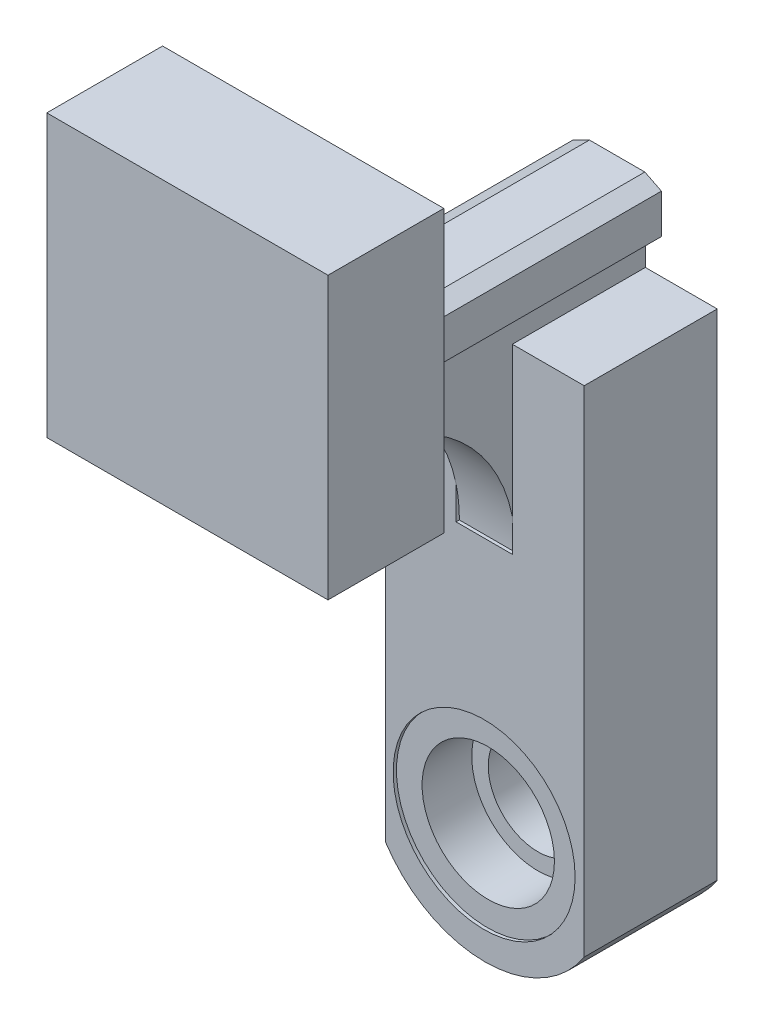
ISO-10303-21;
HEADER;
FILE_DESCRIPTION(('STEP AP214'),'2;1');
FILE_NAME('part.step','',(''),(''),'','','');
FILE_SCHEMA(('AUTOMOTIVE_DESIGN { 1 0 10303 214 1 1 1 1 }'));
ENDSEC;
DATA;
#1=APPLICATION_CONTEXT('core data for automotive mechanical design processes');
#2=APPLICATION_PROTOCOL_DEFINITION('international standard','automotive_design',2000,#1);
#3=PRODUCT_CONTEXT('',#1,'mechanical');
#4=PRODUCT('Part','Part','',(#3));
#5=PRODUCT_RELATED_PRODUCT_CATEGORY('part','',(#4));
#6=PRODUCT_DEFINITION_FORMATION('','',#4);
#7=PRODUCT_DEFINITION_CONTEXT('part definition',#1,'design');
#8=PRODUCT_DEFINITION('design','',#6,#7);
#9=PRODUCT_DEFINITION_SHAPE('','',#8);
#10=(LENGTH_UNIT() NAMED_UNIT(*) SI_UNIT(.MILLI.,.METRE.));
#11=(NAMED_UNIT(*) PLANE_ANGLE_UNIT() SI_UNIT($,.RADIAN.));
#12=(NAMED_UNIT(*) SI_UNIT($,.STERADIAN.) SOLID_ANGLE_UNIT());
#13=UNCERTAINTY_MEASURE_WITH_UNIT(LENGTH_MEASURE(1.E-05),#10,'distance_accuracy_value','');
#14=(GEOMETRIC_REPRESENTATION_CONTEXT(3) GLOBAL_UNCERTAINTY_ASSIGNED_CONTEXT((#13)) GLOBAL_UNIT_ASSIGNED_CONTEXT((#10,
#11,#12)) REPRESENTATION_CONTEXT('',''));
#15=CARTESIAN_POINT('',(0.,0.,0.));
#16=DIRECTION('',(0.,0.,1.));
#17=DIRECTION('',(1.,0.,0.));
#18=AXIS2_PLACEMENT_3D('',#15,#16,#17);
#19=CARTESIAN_POINT('',(-5.97131483799335,-39.8802961275626,0.));
#20=DIRECTION('',(-1.,0.,0.));
#21=DIRECTION('',(0.,0.,1.));
#22=AXIS2_PLACEMENT_3D('',#19,#20,#21);
#23=PLANE('',#22);
#24=DIRECTION('',(0.,-1.,0.));
#25=VECTOR('',#24,1.);
#26=CARTESIAN_POINT('',(-5.97131483799335,-39.8802961275626,0.));
#27=LINE('',#26,#25);
#28=CARTESIAN_POINT('',(-5.97131483799335,-3.88029612756264,0.));
#29=VERTEX_POINT('',#28);
#30=CARTESIAN_POINT('',(-5.97131483799335,-33.7933153747115,0.));
#31=VERTEX_POINT('',#30);
#32=EDGE_CURVE('E244',#29,#31,#27,.T.);
#33=ORIENTED_EDGE('',*,*,#32,.T.);
#34=DIRECTION('',(0.,0.,1.));
#35=VECTOR('',#34,1.);
#36=CARTESIAN_POINT('',(-5.97131483799335,-33.7933153747115,0.));
#37=LINE('',#36,#35);
#38=CARTESIAN_POINT('',(-5.97131483799335,-33.7933153747115,8.04162156925623));
#39=VERTEX_POINT('',#38);
#40=EDGE_CURVE('E229',#31,#39,#37,.T.);
#41=ORIENTED_EDGE('',*,*,#40,.T.);
#42=DIRECTION('',(0.,-1.,0.));
#43=VECTOR('',#42,1.);
#44=CARTESIAN_POINT('',(-5.97131483799335,-3.88029612756264,8.04162156925623));
#45=LINE('',#44,#43);
#46=CARTESIAN_POINT('',(-5.97131483799335,-3.88029612756264,8.04162156925623));
#47=VERTEX_POINT('',#46);
#48=EDGE_CURVE('E509',#47,#39,#45,.T.);
#49=ORIENTED_EDGE('',*,*,#48,.F.);
#50=DIRECTION('',(0.,0.,1.));
#51=VECTOR('',#50,1.);
#52=CARTESIAN_POINT('',(-5.97131483799335,-3.88029612756264,0.));
#53=LINE('',#52,#51);
#54=EDGE_CURVE('E248',#29,#47,#53,.T.);
#55=ORIENTED_EDGE('',*,*,#54,.F.);
#56=EDGE_LOOP('',(#33,#41,#49,#55));
#57=FACE_BOUND('',#56,.T.);
#58=ADVANCED_FACE('F40',(#57),#23,.T.);
#59=CARTESIAN_POINT('',(0.,0.,0.));
#60=DIRECTION('',(0.,0.,1.));
#61=DIRECTION('',(1.,0.,0.));
#62=AXIS2_PLACEMENT_3D('',#59,#60,#61);
#63=PLANE('',#62);
#64=CARTESIAN_POINT('',(0.0286851620066528,-29.8802961275626,0.));
#65=DIRECTION('',(0.,0.,-1.));
#66=DIRECTION('',(-1.,0.,0.));
#67=AXIS2_PLACEMENT_3D('',#64,#65,#66);
#68=CIRCLE('',#67,3.);
#69=CARTESIAN_POINT('',(-2.97131483799335,-29.8802961275626,0.));
#70=VERTEX_POINT('',#69);
#71=EDGE_CURVE('E357',#70,#70,#68,.T.);
#72=ORIENTED_EDGE('',*,*,#71,.F.);
#73=EDGE_LOOP('',(#72));
#74=FACE_BOUND('',#73,.T.);
#75=CARTESIAN_POINT('',(0.0286851620066528,-29.8802961275626,0.));
#76=DIRECTION('',(0.,0.,1.));
#77=DIRECTION('',(1.,0.,0.));
#78=AXIS2_PLACEMENT_3D('',#75,#76,#77);
#79=CIRCLE('',#78,7.16321992043785);
#80=CARTESIAN_POINT('',(6.02868516200665,-33.7933153747115,0.));
#81=VERTEX_POINT('',#80);
#82=EDGE_CURVE('E232',#31,#81,#79,.T.);
#83=ORIENTED_EDGE('',*,*,#82,.F.);
#84=ORIENTED_EDGE('',*,*,#32,.F.);
#85=DIRECTION('',(-1.,0.,0.));
#86=VECTOR('',#85,1.);
#87=CARTESIAN_POINT('',(1.685,-3.88029612756264,0.));
#88=LINE('',#87,#86);
#89=CARTESIAN_POINT('',(-1.715,-3.88029612756264,0.));
#90=VERTEX_POINT('',#89);
#91=EDGE_CURVE('E250',#90,#29,#88,.T.);
#92=ORIENTED_EDGE('',*,*,#91,.F.);
#93=DIRECTION('',(0.,-1.,0.));
#94=VECTOR('',#93,1.);
#95=CARTESIAN_POINT('',(-1.715,-1.78029612756264,0.));
#96=LINE('',#95,#94);
#97=CARTESIAN_POINT('',(-1.715,-1.78029612756264,0.));
#98=VERTEX_POINT('',#97);
#99=EDGE_CURVE('E266',#98,#90,#96,.T.);
#100=ORIENTED_EDGE('',*,*,#99,.F.);
#101=DIRECTION('',(1.,0.,0.));
#102=VECTOR('',#101,1.);
#103=CARTESIAN_POINT('',(-2.695,-1.78029612756264,0.));
#104=LINE('',#103,#102);
#105=CARTESIAN_POINT('',(-2.695,-1.78029612756264,0.));
#106=VERTEX_POINT('',#105);
#107=EDGE_CURVE('E271',#106,#98,#104,.T.);
#108=ORIENTED_EDGE('',*,*,#107,.F.);
#109=DIRECTION('',(0.,-1.,0.));
#110=VECTOR('',#109,1.);
#111=CARTESIAN_POINT('',(-2.695,-1.78029612756264,0.));
#112=LINE('',#111,#110);
#113=CARTESIAN_POINT('',(-2.695,0.599703872437357,0.));
#114=VERTEX_POINT('',#113);
#115=EDGE_CURVE('E309',#114,#106,#112,.T.);
#116=ORIENTED_EDGE('',*,*,#115,.F.);
#117=DIRECTION('',(-0.894427190999916,-0.447213595499958,0.));
#118=VECTOR('',#117,1.);
#119=CARTESIAN_POINT('',(-2.695,0.599703872437357,0.));
#120=LINE('',#119,#118);
#121=CARTESIAN_POINT('',(-1.695,1.09970387243736,0.));
#122=VERTEX_POINT('',#121);
#123=EDGE_CURVE('E307',#122,#114,#120,.T.);
#124=ORIENTED_EDGE('',*,*,#123,.F.);
#125=DIRECTION('',(-1.,0.,0.));
#126=VECTOR('',#125,1.);
#127=CARTESIAN_POINT('',(-1.695,1.09970387243736,0.));
#128=LINE('',#127,#126);
#129=CARTESIAN_POINT('',(1.655,1.09970387243736,0.));
#130=VERTEX_POINT('',#129);
#131=EDGE_CURVE('E305',#130,#122,#128,.T.);
#132=ORIENTED_EDGE('',*,*,#131,.F.);
#133=DIRECTION('',(-0.894427190999916,0.447213595499958,0.));
#134=VECTOR('',#133,1.);
#135=CARTESIAN_POINT('',(2.655,0.599703872437357,0.));
#136=LINE('',#135,#134);
#137=CARTESIAN_POINT('',(2.655,0.599703872437357,0.));
#138=VERTEX_POINT('',#137);
#139=EDGE_CURVE('E303',#138,#130,#136,.T.);
#140=ORIENTED_EDGE('',*,*,#139,.F.);
#141=DIRECTION('',(0.,1.,0.));
#142=VECTOR('',#141,1.);
#143=CARTESIAN_POINT('',(2.655,-1.78029612756264,0.));
#144=LINE('',#143,#142);
#145=CARTESIAN_POINT('',(2.655,-1.78029612756264,0.));
#146=VERTEX_POINT('',#145);
#147=EDGE_CURVE('E301',#146,#138,#144,.T.);
#148=ORIENTED_EDGE('',*,*,#147,.F.);
#149=DIRECTION('',(1.,0.,0.));
#150=VECTOR('',#149,1.);
#151=CARTESIAN_POINT('',(1.685,-1.78029612756264,0.));
#152=LINE('',#151,#150);
#153=CARTESIAN_POINT('',(1.685,-1.78029612756264,0.));
#154=VERTEX_POINT('',#153);
#155=EDGE_CURVE('E299',#154,#146,#152,.T.);
#156=ORIENTED_EDGE('',*,*,#155,.F.);
#157=DIRECTION('',(0.,1.,0.));
#158=VECTOR('',#157,1.);
#159=CARTESIAN_POINT('',(1.685,-1.78029612756264,0.));
#160=LINE('',#159,#158);
#161=CARTESIAN_POINT('',(1.685,-3.88029612756264,0.));
#162=VERTEX_POINT('',#161);
#163=EDGE_CURVE('E297',#162,#154,#160,.T.);
#164=ORIENTED_EDGE('',*,*,#163,.F.);
#165=CARTESIAN_POINT('',(6.02868516200665,-3.88029612756265,0.));
#166=VERTEX_POINT('',#165);
#167=EDGE_CURVE('E253',#166,#162,#88,.T.);
#168=ORIENTED_EDGE('',*,*,#167,.F.);
#169=DIRECTION('',(0.,1.,0.));
#170=VECTOR('',#169,1.);
#171=CARTESIAN_POINT('',(6.02868516200665,-39.8802961275626,0.));
#172=LINE('',#171,#170);
#173=EDGE_CURVE('E246',#81,#166,#172,.T.);
#174=ORIENTED_EDGE('',*,*,#173,.F.);
#175=EDGE_LOOP('',(#83,#84,#92,#100,#108,#116,#124,#132,#140,#148,#156,#164,#168,#174));
#176=FACE_BOUND('',#175,.T.);
#177=ADVANCED_FACE('F242',(#74,#176),#63,.F.);
#178=CARTESIAN_POINT('',(6.02868516200665,-39.8802961275626,0.));
#179=DIRECTION('',(-1.,0.,0.));
#180=DIRECTION('',(0.,0.,1.));
#181=AXIS2_PLACEMENT_3D('',#178,#179,#180);
#182=PLANE('',#181);
#183=DIRECTION('',(0.,0.,1.));
#184=VECTOR('',#183,1.);
#185=CARTESIAN_POINT('',(6.02868516200665,-33.7933153747115,0.));
#186=LINE('',#185,#184);
#187=CARTESIAN_POINT('',(6.02868516200665,-33.7933153747115,8.04162156925623));
#188=VERTEX_POINT('',#187);
#189=EDGE_CURVE('E55',#81,#188,#186,.T.);
#190=ORIENTED_EDGE('',*,*,#189,.F.);
#191=ORIENTED_EDGE('',*,*,#173,.T.);
#192=DIRECTION('',(0.,0.,1.));
#193=VECTOR('',#192,1.);
#194=CARTESIAN_POINT('',(6.02868516200665,-3.88029612756264,0.));
#195=LINE('',#194,#193);
#196=CARTESIAN_POINT('',(6.02868516200665,-3.88029612756264,8.04162156925623));
#197=VERTEX_POINT('',#196);
#198=EDGE_CURVE('E263',#166,#197,#195,.T.);
#199=ORIENTED_EDGE('',*,*,#198,.T.);
#200=DIRECTION('',(0.,1.,0.));
#201=VECTOR('',#200,1.);
#202=CARTESIAN_POINT('',(6.02868516200665,-39.8802961275626,8.04162156925623));
#203=LINE('',#202,#201);
#204=EDGE_CURVE('E512',#188,#197,#203,.T.);
#205=ORIENTED_EDGE('',*,*,#204,.F.);
#206=EDGE_LOOP('',(#190,#191,#199,#205));
#207=FACE_BOUND('',#206,.T.);
#208=ADVANCED_FACE('F575',(#207),#182,.F.);
#209=CARTESIAN_POINT('',(0.,0.,8.04162156925623));
#210=DIRECTION('',(0.,0.,1.));
#211=DIRECTION('',(1.,0.,0.));
#212=AXIS2_PLACEMENT_3D('',#209,#210,#211);
#213=PLANE('',#212);
#214=CARTESIAN_POINT('',(-0.0200000000000005,-29.8802961275626,8.04162156925623));
#215=DIRECTION('',(0.,0.,1.));
#216=DIRECTION('',(1.,0.,0.));
#217=AXIS2_PLACEMENT_3D('',#214,#215,#216);
#218=CIRCLE('',#217,5.5);
#219=CARTESIAN_POINT('',(5.48,-29.8802961275626,8.04162156925623));
#220=VERTEX_POINT('',#219);
#221=EDGE_CURVE('E631',#220,#220,#218,.T.);
#222=ORIENTED_EDGE('',*,*,#221,.F.);
#223=EDGE_LOOP('',(#222));
#224=FACE_BOUND('',#223,.T.);
#225=ORIENTED_EDGE('',*,*,#48,.T.);
#226=CARTESIAN_POINT('',(0.0286851620066528,-29.8802961275626,8.04162156925623));
#227=DIRECTION('',(0.,0.,1.));
#228=DIRECTION('',(1.,0.,0.));
#229=AXIS2_PLACEMENT_3D('',#226,#227,#228);
#230=CIRCLE('',#229,7.16321992043785);
#231=EDGE_CURVE('E233',#39,#188,#230,.T.);
#232=ORIENTED_EDGE('',*,*,#231,.T.);
#233=ORIENTED_EDGE('',*,*,#204,.T.);
#234=DIRECTION('',(-1.,0.,0.));
#235=VECTOR('',#234,1.);
#236=CARTESIAN_POINT('',(6.02868516200665,-3.88029612756264,8.04162156925623));
#237=LINE('',#236,#235);
#238=CARTESIAN_POINT('',(1.685,-3.88029612756264,8.04162156925623));
#239=VERTEX_POINT('',#238);
#240=EDGE_CURVE('E520',#197,#239,#237,.T.);
#241=ORIENTED_EDGE('',*,*,#240,.T.);
#242=DIRECTION('',(0.,-1.,0.));
#243=VECTOR('',#242,1.);
#244=CARTESIAN_POINT('',(1.685,-3.88029612756264,8.04162156925623));
#245=LINE('',#244,#243);
#246=CARTESIAN_POINT('',(1.685,-12.8903212533494,8.04162156925623));
#247=VERTEX_POINT('',#246);
#248=EDGE_CURVE('E524',#239,#247,#245,.T.);
#249=ORIENTED_EDGE('',*,*,#248,.T.);
#250=CARTESIAN_POINT('',(1.685,-14.8802961275626,8.04162156925623));
#251=VERTEX_POINT('',#250);
#252=EDGE_CURVE('E523',#247,#251,#245,.T.);
#253=ORIENTED_EDGE('',*,*,#252,.T.);
#254=DIRECTION('',(-1.,0.,0.));
#255=VECTOR('',#254,1.);
#256=CARTESIAN_POINT('',(1.685,-14.8802961275626,8.04162156925623));
#257=LINE('',#256,#255);
#258=CARTESIAN_POINT('',(-1.715,-14.8802961275626,8.04162156925623));
#259=VERTEX_POINT('',#258);
#260=EDGE_CURVE('E527',#251,#259,#257,.T.);
#261=ORIENTED_EDGE('',*,*,#260,.T.);
#262=DIRECTION('',(0.,1.,0.));
#263=VECTOR('',#262,1.);
#264=CARTESIAN_POINT('',(-1.715,-14.8802961275626,8.04162156925623));
#265=LINE('',#264,#263);
#266=CARTESIAN_POINT('',(-1.715,-12.8903212533494,8.04162156925623));
#267=VERTEX_POINT('',#266);
#268=EDGE_CURVE('E510',#259,#267,#265,.T.);
#269=ORIENTED_EDGE('',*,*,#268,.T.);
#270=CARTESIAN_POINT('',(-1.715,-3.88029612756264,8.04162156925623));
#271=VERTEX_POINT('',#270);
#272=EDGE_CURVE('E515',#267,#271,#265,.T.);
#273=ORIENTED_EDGE('',*,*,#272,.T.);
#274=DIRECTION('',(-1.,0.,0.));
#275=VECTOR('',#274,1.);
#276=CARTESIAN_POINT('',(-1.715,-3.88029612756264,8.04162156925623));
#277=LINE('',#276,#275);
#278=EDGE_CURVE('E507',#271,#47,#277,.T.);
#279=ORIENTED_EDGE('',*,*,#278,.T.);
#280=EDGE_LOOP('',(#225,#232,#233,#241,#249,#253,#261,#269,#273,#279));
#281=FACE_BOUND('',#280,.T.);
#282=ADVANCED_FACE('F544',(#224,#281),#213,.T.);
#283=CARTESIAN_POINT('',(0.,-39.8802961275626,7.84162156925623));
#284=DIRECTION('',(0.,0.,1.));
#285=DIRECTION('',(1.,0.,0.));
#286=AXIS2_PLACEMENT_3D('',#283,#284,#285);
#287=PLANE('',#286);
#288=CARTESIAN_POINT('',(0.0286851620066528,-29.8802961275626,7.84162156925623));
#289=DIRECTION('',(0.,0.,1.));
#290=DIRECTION('',(1.,0.,0.));
#291=AXIS2_PLACEMENT_3D('',#288,#289,#290);
#292=CIRCLE('',#291,4.);
#293=CARTESIAN_POINT('',(4.02868516200665,-29.8802961275626,7.84162156925623));
#294=VERTEX_POINT('',#293);
#295=EDGE_CURVE('E356',#294,#294,#292,.T.);
#296=ORIENTED_EDGE('',*,*,#295,.F.);
#297=EDGE_LOOP('',(#296));
#298=FACE_BOUND('',#297,.T.);
#299=CARTESIAN_POINT('',(-0.0200000000000005,-29.8802961275626,7.84162156925623));
#300=DIRECTION('',(0.,0.,1.));
#301=DIRECTION('',(1.,0.,0.));
#302=AXIS2_PLACEMENT_3D('',#299,#300,#301);
#303=CIRCLE('',#302,5.5);
#304=CARTESIAN_POINT('',(5.48,-29.8802961275626,7.84162156925623));
#305=VERTEX_POINT('',#304);
#306=EDGE_CURVE('E11',#305,#305,#303,.F.);
#307=ORIENTED_EDGE('',*,*,#306,.F.);
#308=EDGE_LOOP('',(#307));
#309=FACE_BOUND('',#308,.T.);
#310=ADVANCED_FACE('F581',(#298,#309),#287,.T.);
#311=CARTESIAN_POINT('',(0.,0.,19.));
#312=DIRECTION('',(0.,0.,1.));
#313=DIRECTION('',(1.,0.,0.));
#314=AXIS2_PLACEMENT_3D('',#311,#312,#313);
#315=PLANE('',#314);
#316=DIRECTION('',(0.,1.,0.));
#317=VECTOR('',#316,1.);
#318=CARTESIAN_POINT('',(1.685,-16.5451754327114,19.));
#319=LINE('',#318,#317);
#320=CARTESIAN_POINT('',(1.685,-4.88029612756264,19.));
#321=VERTEX_POINT('',#320);
#322=CARTESIAN_POINT('',(1.685,-3.88029612756264,19.));
#323=VERTEX_POINT('',#322);
#324=EDGE_CURVE('E374',#321,#323,#319,.T.);
#325=ORIENTED_EDGE('',*,*,#324,.T.);
#326=DIRECTION('',(1.,0.,0.));
#327=VECTOR('',#326,1.);
#328=CARTESIAN_POINT('',(-7.5,-3.88029612756264,19.));
#329=LINE('',#328,#327);
#330=CARTESIAN_POINT('',(7.5,-3.88029612756264,19.));
#331=VERTEX_POINT('',#330);
#332=EDGE_CURVE('E390',#323,#331,#329,.T.);
#333=ORIENTED_EDGE('',*,*,#332,.T.);
#334=DIRECTION('',(0.,1.,0.));
#335=VECTOR('',#334,1.);
#336=CARTESIAN_POINT('',(7.5,-3.88029612756264,19.));
#337=LINE('',#336,#335);
#338=CARTESIAN_POINT('',(7.5,11.1197038724374,19.));
#339=VERTEX_POINT('',#338);
#340=EDGE_CURVE('E394',#331,#339,#337,.T.);
#341=ORIENTED_EDGE('',*,*,#340,.T.);
#342=DIRECTION('',(-1.,0.,0.));
#343=VECTOR('',#342,1.);
#344=CARTESIAN_POINT('',(7.5,11.1197038724374,19.));
#345=LINE('',#344,#343);
#346=CARTESIAN_POINT('',(-7.5,11.1197038724374,19.));
#347=VERTEX_POINT('',#346);
#348=EDGE_CURVE('E379',#339,#347,#345,.T.);
#349=ORIENTED_EDGE('',*,*,#348,.T.);
#350=DIRECTION('',(0.,-1.,0.));
#351=VECTOR('',#350,1.);
#352=CARTESIAN_POINT('',(-7.5,11.1197038724374,19.));
#353=LINE('',#352,#351);
#354=CARTESIAN_POINT('',(-7.5,-3.88029612756264,19.));
#355=VERTEX_POINT('',#354);
#356=EDGE_CURVE('E387',#347,#355,#353,.T.);
#357=ORIENTED_EDGE('',*,*,#356,.T.);
#358=CARTESIAN_POINT('',(-1.715,-3.88029612756264,19.));
#359=VERTEX_POINT('',#358);
#360=EDGE_CURVE('E391',#355,#359,#329,.T.);
#361=ORIENTED_EDGE('',*,*,#360,.T.);
#362=DIRECTION('',(0.,1.,0.));
#363=VECTOR('',#362,1.);
#364=CARTESIAN_POINT('',(-1.715,-16.5451754327114,19.));
#365=LINE('',#364,#363);
#366=CARTESIAN_POINT('',(-1.715,-4.88029612756264,19.));
#367=VERTEX_POINT('',#366);
#368=EDGE_CURVE('E382',#367,#359,#365,.T.);
#369=ORIENTED_EDGE('',*,*,#368,.F.);
#370=DIRECTION('',(1.,0.,0.));
#371=VECTOR('',#370,1.);
#372=CARTESIAN_POINT('',(-8.5,-4.88029612756264,19.));
#373=LINE('',#372,#371);
#374=CARTESIAN_POINT('',(-8.5,-4.88029612756264,19.));
#375=VERTEX_POINT('',#374);
#376=EDGE_CURVE('E418',#375,#367,#373,.T.);
#377=ORIENTED_EDGE('',*,*,#376,.F.);
#378=DIRECTION('',(0.,-1.,0.));
#379=VECTOR('',#378,1.);
#380=CARTESIAN_POINT('',(-8.5,12.1197038724374,19.));
#381=LINE('',#380,#379);
#382=CARTESIAN_POINT('',(-8.5,12.1197038724374,19.));
#383=VERTEX_POINT('',#382);
#384=EDGE_CURVE('E413',#383,#375,#381,.T.);
#385=ORIENTED_EDGE('',*,*,#384,.F.);
#386=DIRECTION('',(-1.,0.,0.));
#387=VECTOR('',#386,1.);
#388=CARTESIAN_POINT('',(8.5,12.1197038724374,19.));
#389=LINE('',#388,#387);
#390=CARTESIAN_POINT('',(8.5,12.1197038724374,19.));
#391=VERTEX_POINT('',#390);
#392=EDGE_CURVE('E410',#391,#383,#389,.T.);
#393=ORIENTED_EDGE('',*,*,#392,.F.);
#394=DIRECTION('',(0.,1.,0.));
#395=VECTOR('',#394,1.);
#396=CARTESIAN_POINT('',(8.5,-4.88029612756264,19.));
#397=LINE('',#396,#395);
#398=CARTESIAN_POINT('',(8.5,-4.88029612756264,19.));
#399=VERTEX_POINT('',#398);
#400=EDGE_CURVE('E421',#399,#391,#397,.T.);
#401=ORIENTED_EDGE('',*,*,#400,.F.);
#402=EDGE_CURVE('E417',#321,#399,#373,.T.);
#403=ORIENTED_EDGE('',*,*,#402,.F.);
#404=EDGE_LOOP('',(#325,#333,#341,#349,#357,#361,#369,#377,#385,#393,#401,#403));
#405=FACE_BOUND('',#404,.T.);
#406=ADVANCED_FACE('F461',(#405),#315,.F.);
#407=CARTESIAN_POINT('',(-1.715,-1.78029612756264,25.));
#408=DIRECTION('',(1.,0.,0.));
#409=DIRECTION('',(0.,1.,0.));
#410=AXIS2_PLACEMENT_3D('',#407,#408,#409);
#411=PLANE('',#410);
#412=DIRECTION('',(0.,0.,-1.));
#413=VECTOR('',#412,1.);
#414=CARTESIAN_POINT('',(-1.715,-3.88029612756264,25.));
#415=LINE('',#414,#413);
#416=EDGE_CURVE('E63',#271,#90,#415,.T.);
#417=ORIENTED_EDGE('',*,*,#416,.F.);
#418=ORIENTED_EDGE('',*,*,#272,.F.);
#419=CARTESIAN_POINT('',(-1.715,-14.8802961275626,17.8416215692562));
#420=DIRECTION('',(1.,0.,0.));
#421=DIRECTION('',(0.,1.,0.));
#422=AXIS2_PLACEMENT_3D('',#419,#420,#421);
#423=CIRCLE('',#422,10.);
#424=CARTESIAN_POINT('',(-1.715,-4.88029612756264,17.8416215692562));
#425=VERTEX_POINT('',#424);
#426=EDGE_CURVE('E352',#267,#425,#423,.T.);
#427=ORIENTED_EDGE('',*,*,#426,.T.);
#428=DIRECTION('',(0.,0.,-1.));
#429=VECTOR('',#428,1.);
#430=CARTESIAN_POINT('',(-1.715,-4.88029612756264,19.));
#431=LINE('',#430,#429);
#432=EDGE_CURVE('E376',#367,#425,#431,.T.);
#433=ORIENTED_EDGE('',*,*,#432,.F.);
#434=ORIENTED_EDGE('',*,*,#368,.T.);
#435=CARTESIAN_POINT('',(-1.715,-3.88029612756264,25.));
#436=VERTEX_POINT('',#435);
#437=EDGE_CURVE('E339',#436,#359,#415,.T.);
#438=ORIENTED_EDGE('',*,*,#437,.F.);
#439=DIRECTION('',(0.,-1.,0.));
#440=VECTOR('',#439,1.);
#441=CARTESIAN_POINT('',(-1.715,-1.78029612756264,25.));
#442=LINE('',#441,#440);
#443=CARTESIAN_POINT('',(-1.715,-1.78029612756264,25.));
#444=VERTEX_POINT('',#443);
#445=EDGE_CURVE('E267',#444,#436,#442,.T.);
#446=ORIENTED_EDGE('',*,*,#445,.F.);
#447=DIRECTION('',(0.,0.,-1.));
#448=VECTOR('',#447,1.);
#449=CARTESIAN_POINT('',(-1.715,-1.78029612756264,25.));
#450=LINE('',#449,#448);
#451=EDGE_CURVE('E295',#444,#98,#450,.T.);
#452=ORIENTED_EDGE('',*,*,#451,.T.);
#453=ORIENTED_EDGE('',*,*,#99,.T.);
#454=EDGE_LOOP('',(#417,#418,#427,#433,#434,#438,#446,#452,#453));
#455=FACE_BOUND('',#454,.T.);
#456=ADVANCED_FACE('F502',(#455),#411,.F.);
#457=CARTESIAN_POINT('',(1.685,-1.78029612756264,25.));
#458=DIRECTION('',(-1.,0.,0.));
#459=DIRECTION('',(0.,-1.,0.));
#460=AXIS2_PLACEMENT_3D('',#457,#458,#459);
#461=PLANE('',#460);
#462=CARTESIAN_POINT('',(1.685,-14.8802961275626,17.8416215692562));
#463=DIRECTION('',(-1.,0.,0.));
#464=DIRECTION('',(0.,-1.,0.));
#465=AXIS2_PLACEMENT_3D('',#462,#463,#464);
#466=CIRCLE('',#465,10.);
#467=CARTESIAN_POINT('',(1.685,-4.88029612756264,17.8416215692562));
#468=VERTEX_POINT('',#467);
#469=EDGE_CURVE('E349',#468,#247,#466,.T.);
#470=ORIENTED_EDGE('',*,*,#469,.T.);
#471=ORIENTED_EDGE('',*,*,#248,.F.);
#472=DIRECTION('',(0.,0.,-1.));
#473=VECTOR('',#472,1.);
#474=CARTESIAN_POINT('',(1.685,-3.88029612756264,25.));
#475=LINE('',#474,#473);
#476=EDGE_CURVE('E335',#239,#162,#475,.T.);
#477=ORIENTED_EDGE('',*,*,#476,.T.);
#478=ORIENTED_EDGE('',*,*,#163,.T.);
#479=DIRECTION('',(0.,0.,-1.));
#480=VECTOR('',#479,1.);
#481=CARTESIAN_POINT('',(1.685,-1.78029612756264,25.));
#482=LINE('',#481,#480);
#483=CARTESIAN_POINT('',(1.685,-1.78029612756264,25.));
#484=VERTEX_POINT('',#483);
#485=EDGE_CURVE('E332',#484,#154,#482,.T.);
#486=ORIENTED_EDGE('',*,*,#485,.F.);
#487=DIRECTION('',(0.,1.,0.));
#488=VECTOR('',#487,1.);
#489=CARTESIAN_POINT('',(1.685,-1.78029612756264,25.));
#490=LINE('',#489,#488);
#491=CARTESIAN_POINT('',(1.685,-3.88029612756264,25.));
#492=VERTEX_POINT('',#491);
#493=EDGE_CURVE('E270',#492,#484,#490,.T.);
#494=ORIENTED_EDGE('',*,*,#493,.F.);
#495=EDGE_CURVE('E336',#492,#323,#475,.T.);
#496=ORIENTED_EDGE('',*,*,#495,.T.);
#497=ORIENTED_EDGE('',*,*,#324,.F.);
#498=DIRECTION('',(0.,0.,1.));
#499=VECTOR('',#498,1.);
#500=CARTESIAN_POINT('',(1.685,-4.88029612756264,7.84162156925623));
#501=LINE('',#500,#499);
#502=EDGE_CURVE('E380',#468,#321,#501,.T.);
#503=ORIENTED_EDGE('',*,*,#502,.F.);
#504=EDGE_LOOP('',(#470,#471,#477,#478,#486,#494,#496,#497,#503));
#505=FACE_BOUND('',#504,.T.);
#506=ADVANCED_FACE('F471',(#505),#461,.F.);
#507=CARTESIAN_POINT('',(1.685,-1.78029612756264,25.));
#508=DIRECTION('',(0.,1.,0.));
#509=DIRECTION('',(0.,0.,1.));
#510=AXIS2_PLACEMENT_3D('',#507,#508,#509);
#511=PLANE('',#510);
#512=ORIENTED_EDGE('',*,*,#155,.T.);
#513=DIRECTION('',(0.,0.,-1.));
#514=VECTOR('',#513,1.);
#515=CARTESIAN_POINT('',(2.655,-1.78029612756264,25.));
#516=LINE('',#515,#514);
#517=CARTESIAN_POINT('',(2.655,-1.78029612756264,25.));
#518=VERTEX_POINT('',#517);
#519=EDGE_CURVE('E329',#518,#146,#516,.T.);
#520=ORIENTED_EDGE('',*,*,#519,.F.);
#521=DIRECTION('',(1.,0.,0.));
#522=VECTOR('',#521,1.);
#523=CARTESIAN_POINT('',(1.685,-1.78029612756264,25.));
#524=LINE('',#523,#522);
#525=EDGE_CURVE('E274',#484,#518,#524,.T.);
#526=ORIENTED_EDGE('',*,*,#525,.F.);
#527=ORIENTED_EDGE('',*,*,#485,.T.);
#528=EDGE_LOOP('',(#512,#520,#526,#527));
#529=FACE_BOUND('',#528,.T.);
#530=ADVANCED_FACE('F475',(#529),#511,.F.);
#531=CARTESIAN_POINT('',(2.655,-1.78029612756264,25.));
#532=DIRECTION('',(-1.,0.,0.));
#533=DIRECTION('',(0.,-1.,0.));
#534=AXIS2_PLACEMENT_3D('',#531,#532,#533);
#535=PLANE('',#534);
#536=ORIENTED_EDGE('',*,*,#147,.T.);
#537=DIRECTION('',(0.,0.,-1.));
#538=VECTOR('',#537,1.);
#539=CARTESIAN_POINT('',(2.655,0.599703872437357,25.));
#540=LINE('',#539,#538);
#541=CARTESIAN_POINT('',(2.655,0.599703872437357,25.));
#542=VERTEX_POINT('',#541);
#543=EDGE_CURVE('E326',#542,#138,#540,.T.);
#544=ORIENTED_EDGE('',*,*,#543,.F.);
#545=DIRECTION('',(0.,1.,0.));
#546=VECTOR('',#545,1.);
#547=CARTESIAN_POINT('',(2.655,-1.78029612756264,25.));
#548=LINE('',#547,#546);
#549=EDGE_CURVE('E277',#518,#542,#548,.T.);
#550=ORIENTED_EDGE('',*,*,#549,.F.);
#551=ORIENTED_EDGE('',*,*,#519,.T.);
#552=EDGE_LOOP('',(#536,#544,#550,#551));
#553=FACE_BOUND('',#552,.T.);
#554=ADVANCED_FACE('F479',(#553),#535,.F.);
#555=CARTESIAN_POINT('',(2.655,0.599703872437357,25.));
#556=DIRECTION('',(-0.447213595499958,-0.894427190999916,0.));
#557=DIRECTION('',(0.894427190999916,-0.447213595499958,0.));
#558=AXIS2_PLACEMENT_3D('',#555,#556,#557);
#559=PLANE('',#558);
#560=ORIENTED_EDGE('',*,*,#139,.T.);
#561=DIRECTION('',(0.,0.,-1.));
#562=VECTOR('',#561,1.);
#563=CARTESIAN_POINT('',(1.655,1.09970387243736,25.));
#564=LINE('',#563,#562);
#565=CARTESIAN_POINT('',(1.655,1.09970387243736,25.));
#566=VERTEX_POINT('',#565);
#567=EDGE_CURVE('E323',#566,#130,#564,.T.);
#568=ORIENTED_EDGE('',*,*,#567,.F.);
#569=DIRECTION('',(-0.894427190999916,0.447213595499958,0.));
#570=VECTOR('',#569,1.);
#571=CARTESIAN_POINT('',(2.655,0.599703872437357,25.));
#572=LINE('',#571,#570);
#573=EDGE_CURVE('E280',#542,#566,#572,.T.);
#574=ORIENTED_EDGE('',*,*,#573,.F.);
#575=ORIENTED_EDGE('',*,*,#543,.T.);
#576=EDGE_LOOP('',(#560,#568,#574,#575));
#577=FACE_BOUND('',#576,.T.);
#578=ADVANCED_FACE('F483',(#577),#559,.F.);
#579=CARTESIAN_POINT('',(-1.695,1.09970387243736,25.));
#580=DIRECTION('',(0.,-1.,0.));
#581=DIRECTION('',(0.,0.,-1.));
#582=AXIS2_PLACEMENT_3D('',#579,#580,#581);
#583=PLANE('',#582);
#584=ORIENTED_EDGE('',*,*,#131,.T.);
#585=DIRECTION('',(0.,0.,-1.));
#586=VECTOR('',#585,1.);
#587=CARTESIAN_POINT('',(-1.695,1.09970387243736,25.));
#588=LINE('',#587,#586);
#589=CARTESIAN_POINT('',(-1.695,1.09970387243736,25.));
#590=VERTEX_POINT('',#589);
#591=EDGE_CURVE('E320',#590,#122,#588,.T.);
#592=ORIENTED_EDGE('',*,*,#591,.F.);
#593=DIRECTION('',(-1.,0.,0.));
#594=VECTOR('',#593,1.);
#595=CARTESIAN_POINT('',(-1.695,1.09970387243736,25.));
#596=LINE('',#595,#594);
#597=EDGE_CURVE('E283',#566,#590,#596,.T.);
#598=ORIENTED_EDGE('',*,*,#597,.F.);
#599=ORIENTED_EDGE('',*,*,#567,.T.);
#600=EDGE_LOOP('',(#584,#592,#598,#599));
#601=FACE_BOUND('',#600,.T.);
#602=ADVANCED_FACE('F487',(#601),#583,.F.);
#603=CARTESIAN_POINT('',(-2.695,0.599703872437357,25.));
#604=DIRECTION('',(0.447213595499958,-0.894427190999916,0.));
#605=DIRECTION('',(0.894427190999916,0.447213595499958,0.));
#606=AXIS2_PLACEMENT_3D('',#603,#604,#605);
#607=PLANE('',#606);
#608=ORIENTED_EDGE('',*,*,#123,.T.);
#609=DIRECTION('',(0.,0.,-1.));
#610=VECTOR('',#609,1.);
#611=CARTESIAN_POINT('',(-2.695,0.599703872437357,25.));
#612=LINE('',#611,#610);
#613=CARTESIAN_POINT('',(-2.695,0.599703872437357,25.));
#614=VERTEX_POINT('',#613);
#615=EDGE_CURVE('E317',#614,#114,#612,.T.);
#616=ORIENTED_EDGE('',*,*,#615,.F.);
#617=DIRECTION('',(-0.894427190999916,-0.447213595499958,0.));
#618=VECTOR('',#617,1.);
#619=CARTESIAN_POINT('',(-2.695,0.599703872437357,25.));
#620=LINE('',#619,#618);
#621=EDGE_CURVE('E286',#590,#614,#620,.T.);
#622=ORIENTED_EDGE('',*,*,#621,.F.);
#623=ORIENTED_EDGE('',*,*,#591,.T.);
#624=EDGE_LOOP('',(#608,#616,#622,#623));
#625=FACE_BOUND('',#624,.T.);
#626=ADVANCED_FACE('F491',(#625),#607,.F.);
#627=CARTESIAN_POINT('',(-2.695,-1.78029612756264,25.));
#628=DIRECTION('',(1.,0.,0.));
#629=DIRECTION('',(0.,0.,-1.));
#630=AXIS2_PLACEMENT_3D('',#627,#628,#629);
#631=PLANE('',#630);
#632=ORIENTED_EDGE('',*,*,#115,.T.);
#633=DIRECTION('',(0.,0.,-1.));
#634=VECTOR('',#633,1.);
#635=CARTESIAN_POINT('',(-2.695,-1.78029612756264,25.));
#636=LINE('',#635,#634);
#637=CARTESIAN_POINT('',(-2.695,-1.78029612756264,25.));
#638=VERTEX_POINT('',#637);
#639=EDGE_CURVE('E314',#638,#106,#636,.T.);
#640=ORIENTED_EDGE('',*,*,#639,.F.);
#641=DIRECTION('',(0.,-1.,0.));
#642=VECTOR('',#641,1.);
#643=CARTESIAN_POINT('',(-2.695,-1.78029612756264,25.));
#644=LINE('',#643,#642);
#645=EDGE_CURVE('E289',#614,#638,#644,.T.);
#646=ORIENTED_EDGE('',*,*,#645,.F.);
#647=ORIENTED_EDGE('',*,*,#615,.T.);
#648=EDGE_LOOP('',(#632,#640,#646,#647));
#649=FACE_BOUND('',#648,.T.);
#650=ADVANCED_FACE('F495',(#649),#631,.F.);
#651=CARTESIAN_POINT('',(-2.695,-1.78029612756264,25.));
#652=DIRECTION('',(0.,1.,0.));
#653=DIRECTION('',(-1.,0.,0.));
#654=AXIS2_PLACEMENT_3D('',#651,#652,#653);
#655=PLANE('',#654);
#656=ORIENTED_EDGE('',*,*,#107,.T.);
#657=ORIENTED_EDGE('',*,*,#451,.F.);
#658=DIRECTION('',(1.,0.,0.));
#659=VECTOR('',#658,1.);
#660=CARTESIAN_POINT('',(-2.695,-1.78029612756264,25.));
#661=LINE('',#660,#659);
#662=EDGE_CURVE('E292',#638,#444,#661,.T.);
#663=ORIENTED_EDGE('',*,*,#662,.F.);
#664=ORIENTED_EDGE('',*,*,#639,.T.);
#665=EDGE_LOOP('',(#656,#657,#663,#664));
#666=FACE_BOUND('',#665,.T.);
#667=ADVANCED_FACE('F500',(#666),#655,.F.);
#668=CARTESIAN_POINT('',(0.,-3.88029612756264,0.));
#669=DIRECTION('',(0.,-1.,0.));
#670=DIRECTION('',(0.,0.,-1.));
#671=AXIS2_PLACEMENT_3D('',#668,#669,#670);
#672=PLANE('',#671);
#673=ORIENTED_EDGE('',*,*,#416,.T.);
#674=ORIENTED_EDGE('',*,*,#91,.T.);
#675=ORIENTED_EDGE('',*,*,#54,.T.);
#676=ORIENTED_EDGE('',*,*,#278,.F.);
#677=EDGE_LOOP('',(#673,#674,#675,#676));
#678=FACE_BOUND('',#677,.T.);
#679=ADVANCED_FACE('F504',(#678),#672,.F.);
#680=ORIENTED_EDGE('',*,*,#240,.F.);
#681=ORIENTED_EDGE('',*,*,#198,.F.);
#682=ORIENTED_EDGE('',*,*,#167,.T.);
#683=ORIENTED_EDGE('',*,*,#476,.F.);
#684=EDGE_LOOP('',(#680,#681,#682,#683));
#685=FACE_BOUND('',#684,.T.);
#686=ADVANCED_FACE('F622',(#685),#672,.F.);
#687=CARTESIAN_POINT('',(0.,0.,25.));
#688=DIRECTION('',(0.,0.,1.));
#689=DIRECTION('',(1.,0.,0.));
#690=AXIS2_PLACEMENT_3D('',#687,#688,#689);
#691=PLANE('',#690);
#692=ORIENTED_EDGE('',*,*,#662,.T.);
#693=ORIENTED_EDGE('',*,*,#445,.T.);
#694=DIRECTION('',(1.,0.,0.));
#695=VECTOR('',#694,1.);
#696=CARTESIAN_POINT('',(-7.5,-3.88029612756264,25.));
#697=LINE('',#696,#695);
#698=CARTESIAN_POINT('',(-7.5,-3.88029612756264,25.));
#699=VERTEX_POINT('',#698);
#700=EDGE_CURVE('E446',#699,#436,#697,.T.);
#701=ORIENTED_EDGE('',*,*,#700,.F.);
#702=DIRECTION('',(0.,-1.,0.));
#703=VECTOR('',#702,1.);
#704=CARTESIAN_POINT('',(-7.5,11.1197038724374,25.));
#705=LINE('',#704,#703);
#706=CARTESIAN_POINT('',(-7.5,11.1197038724374,25.));
#707=VERTEX_POINT('',#706);
#708=EDGE_CURVE('E437',#707,#699,#705,.T.);
#709=ORIENTED_EDGE('',*,*,#708,.F.);
#710=DIRECTION('',(-1.,0.,0.));
#711=VECTOR('',#710,1.);
#712=CARTESIAN_POINT('',(7.5,11.1197038724374,25.));
#713=LINE('',#712,#711);
#714=CARTESIAN_POINT('',(7.5,11.1197038724374,25.));
#715=VERTEX_POINT('',#714);
#716=EDGE_CURVE('E251',#715,#707,#713,.T.);
#717=ORIENTED_EDGE('',*,*,#716,.F.);
#718=DIRECTION('',(0.,1.,0.));
#719=VECTOR('',#718,1.);
#720=CARTESIAN_POINT('',(7.5,-3.88029612756264,25.));
#721=LINE('',#720,#719);
#722=CARTESIAN_POINT('',(7.5,-3.88029612756264,25.));
#723=VERTEX_POINT('',#722);
#724=EDGE_CURVE('E256',#723,#715,#721,.T.);
#725=ORIENTED_EDGE('',*,*,#724,.F.);
#726=EDGE_CURVE('E445',#492,#723,#697,.T.);
#727=ORIENTED_EDGE('',*,*,#726,.F.);
#728=ORIENTED_EDGE('',*,*,#493,.T.);
#729=ORIENTED_EDGE('',*,*,#525,.T.);
#730=ORIENTED_EDGE('',*,*,#549,.T.);
#731=ORIENTED_EDGE('',*,*,#573,.T.);
#732=ORIENTED_EDGE('',*,*,#597,.T.);
#733=ORIENTED_EDGE('',*,*,#621,.T.);
#734=ORIENTED_EDGE('',*,*,#645,.T.);
#735=EDGE_LOOP('',(#692,#693,#701,#709,#717,#725,#727,#728,#729,#730,#731,#732,#733,#734));
#736=FACE_BOUND('',#735,.T.);
#737=ADVANCED_FACE('F468',(#736),#691,.F.);
#738=CARTESIAN_POINT('',(7.5,11.1197038724374,19.));
#739=DIRECTION('',(0.,1.,0.));
#740=DIRECTION('',(0.,0.,1.));
#741=AXIS2_PLACEMENT_3D('',#738,#739,#740);
#742=PLANE('',#741);
#743=DIRECTION('',(0.,0.,1.));
#744=VECTOR('',#743,1.);
#745=CARTESIAN_POINT('',(7.5,11.1197038724374,19.));
#746=LINE('',#745,#744);
#747=EDGE_CURVE('E398',#339,#715,#746,.T.);
#748=ORIENTED_EDGE('',*,*,#747,.T.);
#749=ORIENTED_EDGE('',*,*,#716,.T.);
#750=DIRECTION('',(0.,0.,1.));
#751=VECTOR('',#750,1.);
#752=CARTESIAN_POINT('',(-7.5,11.1197038724374,19.));
#753=LINE('',#752,#751);
#754=EDGE_CURVE('E397',#347,#707,#753,.T.);
#755=ORIENTED_EDGE('',*,*,#754,.F.);
#756=ORIENTED_EDGE('',*,*,#348,.F.);
#757=EDGE_LOOP('',(#748,#749,#755,#756));
#758=FACE_BOUND('',#757,.T.);
#759=ADVANCED_FACE('F458',(#758),#742,.F.);
#760=CARTESIAN_POINT('',(7.5,-3.88029612756264,19.));
#761=DIRECTION('',(1.,0.,0.));
#762=DIRECTION('',(0.,0.,-1.));
#763=AXIS2_PLACEMENT_3D('',#760,#761,#762);
#764=PLANE('',#763);
#765=DIRECTION('',(0.,0.,1.));
#766=VECTOR('',#765,1.);
#767=CARTESIAN_POINT('',(7.5,-3.88029612756264,19.));
#768=LINE('',#767,#766);
#769=EDGE_CURVE('E402',#331,#723,#768,.T.);
#770=ORIENTED_EDGE('',*,*,#769,.T.);
#771=ORIENTED_EDGE('',*,*,#724,.T.);
#772=ORIENTED_EDGE('',*,*,#747,.F.);
#773=ORIENTED_EDGE('',*,*,#340,.F.);
#774=EDGE_LOOP('',(#770,#771,#772,#773));
#775=FACE_BOUND('',#774,.T.);
#776=ADVANCED_FACE('F450',(#775),#764,.F.);
#777=CARTESIAN_POINT('',(-7.5,-3.88029612756264,19.));
#778=DIRECTION('',(0.,-1.,0.));
#779=DIRECTION('',(0.,0.,-1.));
#780=AXIS2_PLACEMENT_3D('',#777,#778,#779);
#781=PLANE('',#780);
#782=ORIENTED_EDGE('',*,*,#700,.T.);
#783=ORIENTED_EDGE('',*,*,#437,.T.);
#784=ORIENTED_EDGE('',*,*,#360,.F.);
#785=DIRECTION('',(0.,0.,1.));
#786=VECTOR('',#785,1.);
#787=CARTESIAN_POINT('',(-7.5,-3.88029612756264,19.));
#788=LINE('',#787,#786);
#789=EDGE_CURVE('E405',#355,#699,#788,.T.);
#790=ORIENTED_EDGE('',*,*,#789,.T.);
#791=EDGE_LOOP('',(#782,#783,#784,#790));
#792=FACE_BOUND('',#791,.T.);
#793=ADVANCED_FACE('F555',(#792),#781,.F.);
#794=ORIENTED_EDGE('',*,*,#332,.F.);
#795=ORIENTED_EDGE('',*,*,#495,.F.);
#796=ORIENTED_EDGE('',*,*,#726,.T.);
#797=ORIENTED_EDGE('',*,*,#769,.F.);
#798=EDGE_LOOP('',(#794,#795,#796,#797));
#799=FACE_BOUND('',#798,.T.);
#800=ADVANCED_FACE('F467',(#799),#781,.F.);
#801=CARTESIAN_POINT('',(-7.5,11.1197038724374,19.));
#802=DIRECTION('',(-1.,0.,0.));
#803=DIRECTION('',(0.,-1.,0.));
#804=AXIS2_PLACEMENT_3D('',#801,#802,#803);
#805=PLANE('',#804);
#806=ORIENTED_EDGE('',*,*,#754,.T.);
#807=ORIENTED_EDGE('',*,*,#708,.T.);
#808=ORIENTED_EDGE('',*,*,#789,.F.);
#809=ORIENTED_EDGE('',*,*,#356,.F.);
#810=EDGE_LOOP('',(#806,#807,#808,#809));
#811=FACE_BOUND('',#810,.T.);
#812=ADVANCED_FACE('F557',(#811),#805,.F.);
#813=CARTESIAN_POINT('',(8.5,12.1197038724374,19.));
#814=DIRECTION('',(0.,1.,0.));
#815=DIRECTION('',(0.,0.,1.));
#816=AXIS2_PLACEMENT_3D('',#813,#814,#815);
#817=PLANE('',#816);
#818=DIRECTION('',(-1.,0.,0.));
#819=VECTOR('',#818,1.);
#820=CARTESIAN_POINT('',(8.5,12.1197038724374,26.));
#821=LINE('',#820,#819);
#822=CARTESIAN_POINT('',(8.5,12.1197038724374,26.));
#823=VERTEX_POINT('',#822);
#824=CARTESIAN_POINT('',(-8.5,12.1197038724374,26.));
#825=VERTEX_POINT('',#824);
#826=EDGE_CURVE('E401',#823,#825,#821,.T.);
#827=ORIENTED_EDGE('',*,*,#826,.F.);
#828=DIRECTION('',(0.,0.,1.));
#829=VECTOR('',#828,1.);
#830=CARTESIAN_POINT('',(8.5,12.1197038724374,19.));
#831=LINE('',#830,#829);
#832=EDGE_CURVE('E435',#391,#823,#831,.T.);
#833=ORIENTED_EDGE('',*,*,#832,.F.);
#834=ORIENTED_EDGE('',*,*,#392,.T.);
#835=DIRECTION('',(0.,0.,1.));
#836=VECTOR('',#835,1.);
#837=CARTESIAN_POINT('',(-8.5,12.1197038724374,19.));
#838=LINE('',#837,#836);
#839=EDGE_CURVE('E424',#383,#825,#838,.T.);
#840=ORIENTED_EDGE('',*,*,#839,.T.);
#841=EDGE_LOOP('',(#827,#833,#834,#840));
#842=FACE_BOUND('',#841,.T.);
#843=ADVANCED_FACE('F559',(#842),#817,.T.);
#844=CARTESIAN_POINT('',(8.5,-4.88029612756264,19.));
#845=DIRECTION('',(1.,0.,0.));
#846=DIRECTION('',(0.,0.,-1.));
#847=AXIS2_PLACEMENT_3D('',#844,#845,#846);
#848=PLANE('',#847);
#849=DIRECTION('',(0.,1.,0.));
#850=VECTOR('',#849,1.);
#851=CARTESIAN_POINT('',(8.5,-4.88029612756264,26.));
#852=LINE('',#851,#850);
#853=CARTESIAN_POINT('',(8.5,-4.88029612756264,26.));
#854=VERTEX_POINT('',#853);
#855=EDGE_CURVE('E414',#854,#823,#852,.T.);
#856=ORIENTED_EDGE('',*,*,#855,.F.);
#857=DIRECTION('',(0.,0.,1.));
#858=VECTOR('',#857,1.);
#859=CARTESIAN_POINT('',(8.5,-4.88029612756264,19.));
#860=LINE('',#859,#858);
#861=EDGE_CURVE('E438',#399,#854,#860,.T.);
#862=ORIENTED_EDGE('',*,*,#861,.F.);
#863=ORIENTED_EDGE('',*,*,#400,.T.);
#864=ORIENTED_EDGE('',*,*,#832,.T.);
#865=EDGE_LOOP('',(#856,#862,#863,#864));
#866=FACE_BOUND('',#865,.T.);
#867=ADVANCED_FACE('F565',(#866),#848,.T.);
#868=CARTESIAN_POINT('',(-8.5,-4.88029612756264,19.));
#869=DIRECTION('',(0.,-1.,0.));
#870=DIRECTION('',(0.,0.,-1.));
#871=AXIS2_PLACEMENT_3D('',#868,#869,#870);
#872=PLANE('',#871);
#873=ORIENTED_EDGE('',*,*,#432,.T.);
#874=DIRECTION('',(1.,0.,0.));
#875=VECTOR('',#874,1.);
#876=CARTESIAN_POINT('',(1.685,-4.88029612756264,17.8416215692562));
#877=LINE('',#876,#875);
#878=EDGE_CURVE('E342',#425,#468,#877,.T.);
#879=ORIENTED_EDGE('',*,*,#878,.T.);
#880=ORIENTED_EDGE('',*,*,#502,.T.);
#881=ORIENTED_EDGE('',*,*,#402,.T.);
#882=ORIENTED_EDGE('',*,*,#861,.T.);
#883=DIRECTION('',(1.,0.,0.));
#884=VECTOR('',#883,1.);
#885=CARTESIAN_POINT('',(-8.5,-4.88029612756264,26.));
#886=LINE('',#885,#884);
#887=CARTESIAN_POINT('',(-8.5,-4.88029612756264,26.));
#888=VERTEX_POINT('',#887);
#889=EDGE_CURVE('E430',#888,#854,#886,.T.);
#890=ORIENTED_EDGE('',*,*,#889,.F.);
#891=DIRECTION('',(0.,0.,1.));
#892=VECTOR('',#891,1.);
#893=CARTESIAN_POINT('',(-8.5,-4.88029612756264,19.));
#894=LINE('',#893,#892);
#895=EDGE_CURVE('E440',#375,#888,#894,.T.);
#896=ORIENTED_EDGE('',*,*,#895,.F.);
#897=ORIENTED_EDGE('',*,*,#376,.T.);
#898=EDGE_LOOP('',(#873,#879,#880,#881,#882,#890,#896,#897));
#899=FACE_BOUND('',#898,.T.);
#900=ADVANCED_FACE('F549',(#899),#872,.T.);
#901=CARTESIAN_POINT('',(-8.5,12.1197038724374,19.));
#902=DIRECTION('',(-1.,0.,0.));
#903=DIRECTION('',(0.,-1.,0.));
#904=AXIS2_PLACEMENT_3D('',#901,#902,#903);
#905=PLANE('',#904);
#906=DIRECTION('',(0.,-1.,0.));
#907=VECTOR('',#906,1.);
#908=CARTESIAN_POINT('',(-8.5,12.1197038724374,26.));
#909=LINE('',#908,#907);
#910=EDGE_CURVE('E427',#825,#888,#909,.T.);
#911=ORIENTED_EDGE('',*,*,#910,.F.);
#912=ORIENTED_EDGE('',*,*,#839,.F.);
#913=ORIENTED_EDGE('',*,*,#384,.T.);
#914=ORIENTED_EDGE('',*,*,#895,.T.);
#915=EDGE_LOOP('',(#911,#912,#913,#914));
#916=FACE_BOUND('',#915,.T.);
#917=ADVANCED_FACE('F613',(#916),#905,.T.);
#918=CARTESIAN_POINT('',(0.,0.,26.));
#919=DIRECTION('',(0.,0.,1.));
#920=DIRECTION('',(1.,0.,0.));
#921=AXIS2_PLACEMENT_3D('',#918,#919,#920);
#922=PLANE('',#921);
#923=ORIENTED_EDGE('',*,*,#826,.T.);
#924=ORIENTED_EDGE('',*,*,#910,.T.);
#925=ORIENTED_EDGE('',*,*,#889,.T.);
#926=ORIENTED_EDGE('',*,*,#855,.T.);
#927=EDGE_LOOP('',(#923,#924,#925,#926));
#928=FACE_BOUND('',#927,.T.);
#929=ADVANCED_FACE('F615',(#928),#922,.T.);
#930=CARTESIAN_POINT('',(-8.5,-14.8802961275626,17.8416215692562));
#931=DIRECTION('',(-1.,0.,0.));
#932=DIRECTION('',(0.,0.,1.));
#933=AXIS2_PLACEMENT_3D('',#930,#931,#932);
#934=CYLINDRICAL_SURFACE('',#933,10.);
#935=CARTESIAN_POINT('',(-1.715,-14.8802961275626,7.84162156925623));
#936=VERTEX_POINT('',#935);
#937=EDGE_CURVE('E48',#936,#267,#423,.T.);
#938=ORIENTED_EDGE('',*,*,#937,.F.);
#939=DIRECTION('',(1.,0.,0.));
#940=VECTOR('',#939,1.);
#941=CARTESIAN_POINT('',(-1.715,-14.8802961275626,7.84162156925623));
#942=LINE('',#941,#940);
#943=CARTESIAN_POINT('',(1.685,-14.8802961275626,7.84162156925623));
#944=VERTEX_POINT('',#943);
#945=EDGE_CURVE('E345',#944,#936,#942,.F.);
#946=ORIENTED_EDGE('',*,*,#945,.F.);
#947=EDGE_CURVE('E348',#247,#944,#466,.T.);
#948=ORIENTED_EDGE('',*,*,#947,.F.);
#949=ORIENTED_EDGE('',*,*,#469,.F.);
#950=ORIENTED_EDGE('',*,*,#878,.F.);
#951=ORIENTED_EDGE('',*,*,#426,.F.);
#952=EDGE_LOOP('',(#938,#946,#948,#949,#950,#951));
#953=FACE_BOUND('',#952,.T.);
#954=ADVANCED_FACE('F42',(#953),#934,.F.);
#955=CARTESIAN_POINT('',(0.0286851620066528,-29.8802961275626,4.84162156925623));
#956=DIRECTION('',(0.,0.,1.));
#957=DIRECTION('',(1.,0.,0.));
#958=AXIS2_PLACEMENT_3D('',#955,#956,#957);
#959=PLANE('',#958);
#960=CARTESIAN_POINT('',(0.0286851620066528,-29.8802961275626,4.84162156925623));
#961=DIRECTION('',(0.,0.,1.));
#962=DIRECTION('',(1.,0.,0.));
#963=AXIS2_PLACEMENT_3D('',#960,#961,#962);
#964=CIRCLE('',#963,3.);
#965=CARTESIAN_POINT('',(3.02868516200665,-29.8802961275626,4.84162156925623));
#966=VERTEX_POINT('',#965);
#967=EDGE_CURVE('E354',#966,#966,#964,.T.);
#968=ORIENTED_EDGE('',*,*,#967,.F.);
#969=EDGE_LOOP('',(#968));
#970=FACE_BOUND('',#969,.T.);
#971=CARTESIAN_POINT('',(0.0286851620066528,-29.8802961275626,4.84162156925623));
#972=DIRECTION('',(0.,0.,1.));
#973=DIRECTION('',(1.,0.,0.));
#974=AXIS2_PLACEMENT_3D('',#971,#972,#973);
#975=CIRCLE('',#974,4.);
#976=CARTESIAN_POINT('',(4.02868516200665,-29.8802961275626,4.84162156925623));
#977=VERTEX_POINT('',#976);
#978=EDGE_CURVE('E361',#977,#977,#975,.T.);
#979=ORIENTED_EDGE('',*,*,#978,.T.);
#980=EDGE_LOOP('',(#979));
#981=FACE_BOUND('',#980,.T.);
#982=ADVANCED_FACE('F658',(#970,#981),#959,.T.);
#983=CARTESIAN_POINT('',(0.0286851620066528,-29.8802961275626,4.84162156925623));
#984=DIRECTION('',(0.,0.,1.));
#985=DIRECTION('',(1.,0.,0.));
#986=AXIS2_PLACEMENT_3D('',#983,#984,#985);
#987=CYLINDRICAL_SURFACE('',#986,4.);
#988=ORIENTED_EDGE('',*,*,#978,.F.);
#989=EDGE_LOOP('',(#988));
#990=FACE_BOUND('',#989,.T.);
#991=ORIENTED_EDGE('',*,*,#295,.T.);
#992=EDGE_LOOP('',(#991));
#993=FACE_BOUND('',#992,.T.);
#994=ADVANCED_FACE('F657',(#990,#993),#987,.F.);
#995=CARTESIAN_POINT('',(0.0286851620066528,-29.8802961275626,9.));
#996=DIRECTION('',(0.,0.,-1.));
#997=DIRECTION('',(-1.,0.,0.));
#998=AXIS2_PLACEMENT_3D('',#995,#996,#997);
#999=CYLINDRICAL_SURFACE('',#998,3.);
#1000=ORIENTED_EDGE('',*,*,#967,.T.);
#1001=EDGE_LOOP('',(#1000));
#1002=FACE_BOUND('',#1001,.T.);
#1003=ORIENTED_EDGE('',*,*,#71,.T.);
#1004=EDGE_LOOP('',(#1003));
#1005=FACE_BOUND('',#1004,.T.);
#1006=ADVANCED_FACE('F654',(#1002,#1005),#999,.F.);
#1007=CARTESIAN_POINT('',(-1.715,-14.8802961275626,8.04162156925623));
#1008=DIRECTION('',(-1.,0.,0.));
#1009=DIRECTION('',(0.,0.,1.));
#1010=AXIS2_PLACEMENT_3D('',#1007,#1008,#1009);
#1011=PLANE('',#1010);
#1012=DIRECTION('',(0.,0.,-1.));
#1013=VECTOR('',#1012,1.);
#1014=CARTESIAN_POINT('',(-1.715,-14.8802961275626,8.04162156925623));
#1015=LINE('',#1014,#1013);
#1016=EDGE_CURVE('E369',#259,#936,#1015,.T.);
#1017=ORIENTED_EDGE('',*,*,#1016,.T.);
#1018=ORIENTED_EDGE('',*,*,#937,.T.);
#1019=ORIENTED_EDGE('',*,*,#268,.F.);
#1020=EDGE_LOOP('',(#1017,#1018,#1019));
#1021=FACE_BOUND('',#1020,.T.);
#1022=ADVANCED_FACE('F532',(#1021),#1011,.F.);
#1023=CARTESIAN_POINT('',(1.685,-3.88029612756264,8.04162156925623));
#1024=DIRECTION('',(1.,0.,0.));
#1025=DIRECTION('',(0.,0.,-1.));
#1026=AXIS2_PLACEMENT_3D('',#1023,#1024,#1025);
#1027=PLANE('',#1026);
#1028=ORIENTED_EDGE('',*,*,#252,.F.);
#1029=ORIENTED_EDGE('',*,*,#947,.T.);
#1030=DIRECTION('',(0.,0.,-1.));
#1031=VECTOR('',#1030,1.);
#1032=CARTESIAN_POINT('',(1.685,-14.8802961275626,8.04162156925623));
#1033=LINE('',#1032,#1031);
#1034=EDGE_CURVE('E364',#251,#944,#1033,.T.);
#1035=ORIENTED_EDGE('',*,*,#1034,.F.);
#1036=EDGE_LOOP('',(#1028,#1029,#1035));
#1037=FACE_BOUND('',#1036,.T.);
#1038=ADVANCED_FACE('F542',(#1037),#1027,.F.);
#1039=CARTESIAN_POINT('',(1.685,-14.8802961275626,8.04162156925623));
#1040=DIRECTION('',(0.,-1.,0.));
#1041=DIRECTION('',(0.,0.,-1.));
#1042=AXIS2_PLACEMENT_3D('',#1039,#1040,#1041);
#1043=PLANE('',#1042);
#1044=ORIENTED_EDGE('',*,*,#945,.T.);
#1045=ORIENTED_EDGE('',*,*,#1016,.F.);
#1046=ORIENTED_EDGE('',*,*,#260,.F.);
#1047=ORIENTED_EDGE('',*,*,#1034,.T.);
#1048=EDGE_LOOP('',(#1044,#1045,#1046,#1047));
#1049=FACE_BOUND('',#1048,.T.);
#1050=ADVANCED_FACE('F535',(#1049),#1043,.F.);
#1051=CARTESIAN_POINT('',(-0.0200000000000005,-29.8802961275626,8.04162156925623));
#1052=DIRECTION('',(0.,0.,-1.));
#1053=DIRECTION('',(-1.,0.,0.));
#1054=AXIS2_PLACEMENT_3D('',#1051,#1052,#1053);
#1055=CYLINDRICAL_SURFACE('',#1054,5.5);
#1056=ORIENTED_EDGE('',*,*,#221,.T.);
#1057=EDGE_LOOP('',(#1056));
#1058=FACE_BOUND('',#1057,.T.);
#1059=ORIENTED_EDGE('',*,*,#306,.T.);
#1060=EDGE_LOOP('',(#1059));
#1061=FACE_BOUND('',#1060,.T.);
#1062=ADVANCED_FACE('F637',(#1058,#1061),#1055,.F.);
#1063=CARTESIAN_POINT('',(0.0286851620066528,-29.8802961275626,0.));
#1064=DIRECTION('',(0.,0.,1.));
#1065=DIRECTION('',(1.,0.,0.));
#1066=AXIS2_PLACEMENT_3D('',#1063,#1064,#1065);
#1067=CYLINDRICAL_SURFACE('',#1066,7.16321992043785);
#1068=ORIENTED_EDGE('',*,*,#231,.F.);
#1069=ORIENTED_EDGE('',*,*,#40,.F.);
#1070=ORIENTED_EDGE('',*,*,#82,.T.);
#1071=ORIENTED_EDGE('',*,*,#189,.T.);
#1072=EDGE_LOOP('',(#1068,#1069,#1070,#1071));
#1073=FACE_BOUND('',#1072,.T.);
#1074=ADVANCED_FACE('F231',(#1073),#1067,.T.);
#1075=CLOSED_SHELL('',(#58,#177,#208,#282,#310,#406,#456,#506,#530,#554,#578,#602,#626,#650,
#667,#679,#686,#737,#759,#776,#793,#800,#812,#843,#867,#900,#917,#929,#954,#982,#994,#1006,
#1022,#1038,#1050,#1062,#1074));
#1076=MANIFOLD_SOLID_BREP('B2',#1075);
#1077=ADVANCED_BREP_SHAPE_REPRESENTATION('',(#18,#1076),#14);
#1078=SHAPE_DEFINITION_REPRESENTATION(#9,#1077);
ENDSEC;
END-ISO-10303-21;
